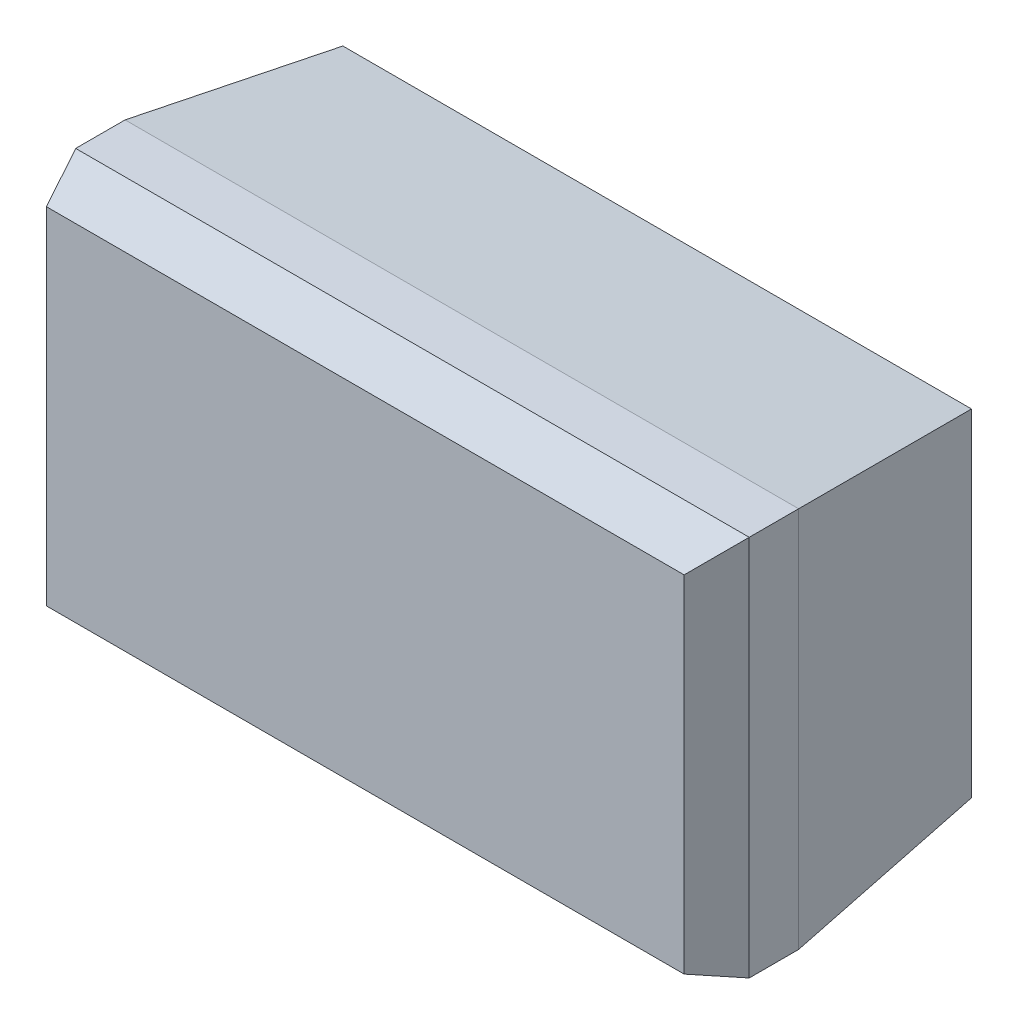
ISO-10303-21;
HEADER;
FILE_DESCRIPTION(('STEP AP214'),'2;1');
FILE_NAME('part.step','',(''),(''),'','','');
FILE_SCHEMA(('AUTOMOTIVE_DESIGN { 1 0 10303 214 1 1 1 1 }'));
ENDSEC;
DATA;
#1=APPLICATION_CONTEXT('core data for automotive mechanical design processes');
#2=APPLICATION_PROTOCOL_DEFINITION('international standard','automotive_design',2000,#1);
#3=PRODUCT_CONTEXT('',#1,'mechanical');
#4=PRODUCT('Part','Part','',(#3));
#5=PRODUCT_RELATED_PRODUCT_CATEGORY('part','',(#4));
#6=PRODUCT_DEFINITION_FORMATION('','',#4);
#7=PRODUCT_DEFINITION_CONTEXT('part definition',#1,'design');
#8=PRODUCT_DEFINITION('design','',#6,#7);
#9=PRODUCT_DEFINITION_SHAPE('','',#8);
#10=(LENGTH_UNIT() NAMED_UNIT(*) SI_UNIT(.MILLI.,.METRE.));
#11=(NAMED_UNIT(*) PLANE_ANGLE_UNIT() SI_UNIT($,.RADIAN.));
#12=(NAMED_UNIT(*) SI_UNIT($,.STERADIAN.) SOLID_ANGLE_UNIT());
#13=UNCERTAINTY_MEASURE_WITH_UNIT(LENGTH_MEASURE(1.E-05),#10,'distance_accuracy_value','');
#14=(GEOMETRIC_REPRESENTATION_CONTEXT(3) GLOBAL_UNCERTAINTY_ASSIGNED_CONTEXT((#13)) GLOBAL_UNIT_ASSIGNED_CONTEXT((#10,
#11,#12)) REPRESENTATION_CONTEXT('',''));
#15=CARTESIAN_POINT('',(0.,0.,0.));
#16=DIRECTION('',(0.,0.,1.));
#17=DIRECTION('',(1.,0.,0.));
#18=AXIS2_PLACEMENT_3D('',#15,#16,#17);
#19=CARTESIAN_POINT('',(0.,0.,0.));
#20=DIRECTION('',(0.,0.,1.));
#21=DIRECTION('',(1.,0.,0.));
#22=AXIS2_PLACEMENT_3D('',#19,#20,#21);
#23=PLANE('',#22);
#24=DIRECTION('',(1.,0.,0.));
#25=VECTOR('',#24,1.);
#26=CARTESIAN_POINT('',(1.5,0.750000000000417,0.));
#27=LINE('',#26,#25);
#28=CARTESIAN_POINT('',(-1.40000000000021,0.750000000000104,0.));
#29=VERTEX_POINT('',#28);
#30=CARTESIAN_POINT('',(1.40000000000021,0.750000000000104,0.));
#31=VERTEX_POINT('',#30);
#32=EDGE_CURVE('E108',#29,#31,#27,.T.);
#33=ORIENTED_EDGE('',*,*,#32,.T.);
#34=DIRECTION('',(0.,1.,0.));
#35=VECTOR('',#34,1.);
#36=CARTESIAN_POINT('',(1.40000000000042,-0.85,0.));
#37=LINE('',#36,#35);
#38=CARTESIAN_POINT('',(1.4000000000001,-0.750000000000209,0.));
#39=VERTEX_POINT('',#38);
#40=EDGE_CURVE('E86',#31,#39,#37,.F.);
#41=ORIENTED_EDGE('',*,*,#40,.T.);
#42=DIRECTION('',(1.,0.,0.));
#43=VECTOR('',#42,1.);
#44=CARTESIAN_POINT('',(-1.5,-0.750000000000417,0.));
#45=LINE('',#44,#43);
#46=CARTESIAN_POINT('',(-1.4000000000001,-0.750000000000104,0.));
#47=VERTEX_POINT('',#46);
#48=EDGE_CURVE('E80',#39,#47,#45,.F.);
#49=ORIENTED_EDGE('',*,*,#48,.T.);
#50=DIRECTION('',(0.,1.,0.));
#51=VECTOR('',#50,1.);
#52=CARTESIAN_POINT('',(-1.40000000000042,0.85,0.));
#53=LINE('',#52,#51);
#54=EDGE_CURVE('E20',#47,#29,#53,.T.);
#55=ORIENTED_EDGE('',*,*,#54,.T.);
#56=EDGE_LOOP('',(#33,#41,#49,#55));
#57=FACE_BOUND('',#56,.T.);
#58=ADVANCED_FACE('F17',(#57),#23,.F.);
#59=CARTESIAN_POINT('',(-1.5,0.85,0.87));
#60=DIRECTION('',(0.993458851833167,0.,0.114190672624019));
#61=DIRECTION('',(0.114190672624019,0.,-0.993458851833167));
#62=AXIS2_PLACEMENT_3D('',#59,#60,#61);
#63=PLANE('',#62);
#64=DIRECTION('',(-0.113453380097414,-0.113453380096941,0.98704440684756));
#65=VECTOR('',#64,1.);
#66=CARTESIAN_POINT('',(-1.4,-0.750000000000417,0.));
#67=LINE('',#66,#65);
#68=CARTESIAN_POINT('',(-1.5,-0.85,0.87));
#69=VERTEX_POINT('',#68);
#70=EDGE_CURVE('E88',#47,#69,#67,.T.);
#71=ORIENTED_EDGE('',*,*,#70,.T.);
#72=DIRECTION('',(0.,1.,0.));
#73=VECTOR('',#72,1.);
#74=CARTESIAN_POINT('',(-1.5,0.85,0.87));
#75=LINE('',#74,#73);
#76=CARTESIAN_POINT('',(-1.5,0.85,0.87));
#77=VERTEX_POINT('',#76);
#78=EDGE_CURVE('E110',#69,#77,#75,.T.);
#79=ORIENTED_EDGE('',*,*,#78,.T.);
#80=DIRECTION('',(0.113453380097415,-0.113453380096941,-0.98704440684756));
#81=VECTOR('',#80,1.);
#82=CARTESIAN_POINT('',(-1.5,0.85,0.87));
#83=LINE('',#82,#81);
#84=EDGE_CURVE('E93',#77,#29,#83,.T.);
#85=ORIENTED_EDGE('',*,*,#84,.T.);
#86=ORIENTED_EDGE('',*,*,#54,.F.);
#87=EDGE_LOOP('',(#71,#79,#85,#86));
#88=FACE_BOUND('',#87,.T.);
#89=ADVANCED_FACE('F90',(#88),#63,.F.);
#90=CARTESIAN_POINT('',(-1.5,-0.85,0.87));
#91=DIRECTION('',(0.,0.993458851833167,0.114190672624019));
#92=DIRECTION('',(0.,-0.114190672624019,0.993458851833167));
#93=AXIS2_PLACEMENT_3D('',#90,#91,#92);
#94=PLANE('',#93);
#95=ORIENTED_EDGE('',*,*,#70,.F.);
#96=ORIENTED_EDGE('',*,*,#48,.F.);
#97=DIRECTION('',(0.113453380096941,-0.113453380097414,0.98704440684756));
#98=VECTOR('',#97,1.);
#99=CARTESIAN_POINT('',(1.40000000000042,-0.75,0.));
#100=LINE('',#99,#98);
#101=CARTESIAN_POINT('',(1.5,-0.85,0.87));
#102=VERTEX_POINT('',#101);
#103=EDGE_CURVE('E100',#39,#102,#100,.T.);
#104=ORIENTED_EDGE('',*,*,#103,.T.);
#105=DIRECTION('',(1.,0.,0.));
#106=VECTOR('',#105,1.);
#107=CARTESIAN_POINT('',(-1.5,-0.85,0.87));
#108=LINE('',#107,#106);
#109=EDGE_CURVE('E98',#102,#69,#108,.F.);
#110=ORIENTED_EDGE('',*,*,#109,.T.);
#111=EDGE_LOOP('',(#95,#96,#104,#110));
#112=FACE_BOUND('',#111,.T.);
#113=ADVANCED_FACE('F96',(#112),#94,.F.);
#114=CARTESIAN_POINT('',(1.5,-0.85,0.87));
#115=DIRECTION('',(-0.993458851833167,0.,0.114190672624019));
#116=DIRECTION('',(0.114190672624019,0.,0.993458851833167));
#117=AXIS2_PLACEMENT_3D('',#114,#115,#116);
#118=PLANE('',#117);
#119=DIRECTION('',(0.113453380097414,0.113453380096941,0.98704440684756));
#120=VECTOR('',#119,1.);
#121=CARTESIAN_POINT('',(1.4,0.750000000000417,0.));
#122=LINE('',#121,#120);
#123=CARTESIAN_POINT('',(1.5,0.85,0.87));
#124=VERTEX_POINT('',#123);
#125=EDGE_CURVE('E105',#31,#124,#122,.T.);
#126=ORIENTED_EDGE('',*,*,#125,.T.);
#127=DIRECTION('',(0.,-1.,0.));
#128=VECTOR('',#127,1.);
#129=CARTESIAN_POINT('',(1.5,-0.85,0.87));
#130=LINE('',#129,#128);
#131=EDGE_CURVE('E117',#124,#102,#130,.T.);
#132=ORIENTED_EDGE('',*,*,#131,.T.);
#133=ORIENTED_EDGE('',*,*,#103,.F.);
#134=ORIENTED_EDGE('',*,*,#40,.F.);
#135=EDGE_LOOP('',(#126,#132,#133,#134));
#136=FACE_BOUND('',#135,.T.);
#137=ADVANCED_FACE('F184',(#136),#118,.F.);
#138=CARTESIAN_POINT('',(1.5,0.85,0.87));
#139=DIRECTION('',(0.,-0.993458851833167,0.114190672624019));
#140=DIRECTION('',(0.,-0.114190672624019,-0.993458851833167));
#141=AXIS2_PLACEMENT_3D('',#138,#139,#140);
#142=PLANE('',#141);
#143=ORIENTED_EDGE('',*,*,#84,.F.);
#144=DIRECTION('',(1.,0.,0.));
#145=VECTOR('',#144,1.);
#146=CARTESIAN_POINT('',(1.5,0.85,0.87));
#147=LINE('',#146,#145);
#148=EDGE_CURVE('E125',#77,#124,#147,.T.);
#149=ORIENTED_EDGE('',*,*,#148,.T.);
#150=ORIENTED_EDGE('',*,*,#125,.F.);
#151=ORIENTED_EDGE('',*,*,#32,.F.);
#152=EDGE_LOOP('',(#143,#149,#150,#151));
#153=FACE_BOUND('',#152,.T.);
#154=ADVANCED_FACE('F187',(#153),#142,.F.);
#155=CARTESIAN_POINT('',(-1.5,0.85,1.3));
#156=DIRECTION('',(1.,0.,0.));
#157=DIRECTION('',(0.,1.,0.));
#158=AXIS2_PLACEMENT_3D('',#155,#156,#157);
#159=PLANE('',#158);
#160=DIRECTION('',(0.,0.,1.));
#161=VECTOR('',#160,1.);
#162=CARTESIAN_POINT('',(-1.5,-0.85,1.3));
#163=LINE('',#162,#161);
#164=CARTESIAN_POINT('',(-1.5,-0.85,1.09));
#165=VERTEX_POINT('',#164);
#166=EDGE_CURVE('E112',#69,#165,#163,.T.);
#167=ORIENTED_EDGE('',*,*,#166,.T.);
#168=DIRECTION('',(0.,1.,0.));
#169=VECTOR('',#168,1.);
#170=CARTESIAN_POINT('',(-1.5,0.,1.09));
#171=LINE('',#170,#169);
#172=CARTESIAN_POINT('',(-1.5,0.85,1.09));
#173=VERTEX_POINT('',#172);
#174=EDGE_CURVE('E128',#173,#165,#171,.F.);
#175=ORIENTED_EDGE('',*,*,#174,.F.);
#176=DIRECTION('',(0.,0.,-1.));
#177=VECTOR('',#176,1.);
#178=CARTESIAN_POINT('',(-1.5,0.85,1.3));
#179=LINE('',#178,#177);
#180=EDGE_CURVE('E122',#173,#77,#179,.T.);
#181=ORIENTED_EDGE('',*,*,#180,.T.);
#182=ORIENTED_EDGE('',*,*,#78,.F.);
#183=EDGE_LOOP('',(#167,#175,#181,#182));
#184=FACE_BOUND('',#183,.T.);
#185=ADVANCED_FACE('F181',(#184),#159,.F.);
#186=CARTESIAN_POINT('',(-1.5,-0.85,1.3));
#187=DIRECTION('',(0.,1.,0.));
#188=DIRECTION('',(0.,0.,1.));
#189=AXIS2_PLACEMENT_3D('',#186,#187,#188);
#190=PLANE('',#189);
#191=DIRECTION('',(0.,0.,1.));
#192=VECTOR('',#191,1.);
#193=CARTESIAN_POINT('',(1.5,-0.85,1.3));
#194=LINE('',#193,#192);
#195=CARTESIAN_POINT('',(1.5,-0.85,1.09));
#196=VERTEX_POINT('',#195);
#197=EDGE_CURVE('E115',#102,#196,#194,.T.);
#198=ORIENTED_EDGE('',*,*,#197,.T.);
#199=DIRECTION('',(1.,0.,0.));
#200=VECTOR('',#199,1.);
#201=CARTESIAN_POINT('',(0.,-0.85,1.09));
#202=LINE('',#201,#200);
#203=EDGE_CURVE('E134',#165,#196,#202,.T.);
#204=ORIENTED_EDGE('',*,*,#203,.F.);
#205=ORIENTED_EDGE('',*,*,#166,.F.);
#206=ORIENTED_EDGE('',*,*,#109,.F.);
#207=EDGE_LOOP('',(#198,#204,#205,#206));
#208=FACE_BOUND('',#207,.T.);
#209=ADVANCED_FACE('F182',(#208),#190,.F.);
#210=CARTESIAN_POINT('',(1.5,-0.85,1.3));
#211=DIRECTION('',(-1.,0.,0.));
#212=DIRECTION('',(0.,-1.,0.));
#213=AXIS2_PLACEMENT_3D('',#210,#211,#212);
#214=PLANE('',#213);
#215=DIRECTION('',(0.,0.,-1.));
#216=VECTOR('',#215,1.);
#217=CARTESIAN_POINT('',(1.5,0.85,1.3));
#218=LINE('',#217,#216);
#219=CARTESIAN_POINT('',(1.5,0.85,1.09));
#220=VERTEX_POINT('',#219);
#221=EDGE_CURVE('E120',#124,#220,#218,.F.);
#222=ORIENTED_EDGE('',*,*,#221,.T.);
#223=DIRECTION('',(0.,1.,0.));
#224=VECTOR('',#223,1.);
#225=CARTESIAN_POINT('',(1.5,0.,1.09));
#226=LINE('',#225,#224);
#227=EDGE_CURVE('E140',#196,#220,#226,.T.);
#228=ORIENTED_EDGE('',*,*,#227,.F.);
#229=ORIENTED_EDGE('',*,*,#197,.F.);
#230=ORIENTED_EDGE('',*,*,#131,.F.);
#231=EDGE_LOOP('',(#222,#228,#229,#230));
#232=FACE_BOUND('',#231,.T.);
#233=ADVANCED_FACE('F168',(#232),#214,.F.);
#234=CARTESIAN_POINT('',(1.5,0.85,1.3));
#235=DIRECTION('',(0.,-1.,0.));
#236=DIRECTION('',(0.,0.,-1.));
#237=AXIS2_PLACEMENT_3D('',#234,#235,#236);
#238=PLANE('',#237);
#239=ORIENTED_EDGE('',*,*,#180,.F.);
#240=DIRECTION('',(1.,0.,0.));
#241=VECTOR('',#240,1.);
#242=CARTESIAN_POINT('',(0.,0.85,1.09));
#243=LINE('',#242,#241);
#244=EDGE_CURVE('E146',#220,#173,#243,.F.);
#245=ORIENTED_EDGE('',*,*,#244,.F.);
#246=ORIENTED_EDGE('',*,*,#221,.F.);
#247=ORIENTED_EDGE('',*,*,#148,.F.);
#248=EDGE_LOOP('',(#239,#245,#246,#247));
#249=FACE_BOUND('',#248,.T.);
#250=ADVANCED_FACE('F174',(#249),#238,.F.);
#251=CARTESIAN_POINT('',(-1.42,0.,1.3));
#252=DIRECTION('',(-0.934487734928968,0.,0.355995327591988));
#253=DIRECTION('',(0.355995327591988,0.,0.934487734928968));
#254=AXIS2_PLACEMENT_3D('',#251,#252,#253);
#255=PLANE('',#254);
#256=DIRECTION('',(-0.335377446520255,-0.335377446520255,-0.880365797115669));
#257=VECTOR('',#256,1.);
#258=CARTESIAN_POINT('',(-1.42,-0.77,1.3));
#259=LINE('',#258,#257);
#260=CARTESIAN_POINT('',(-1.42,-0.77,1.3));
#261=VERTEX_POINT('',#260);
#262=EDGE_CURVE('E131',#261,#165,#259,.T.);
#263=ORIENTED_EDGE('',*,*,#262,.F.);
#264=DIRECTION('',(0.,1.,0.));
#265=VECTOR('',#264,1.);
#266=CARTESIAN_POINT('',(-1.42,0.,1.3));
#267=LINE('',#266,#265);
#268=CARTESIAN_POINT('',(-1.42,0.77,1.3));
#269=VERTEX_POINT('',#268);
#270=EDGE_CURVE('E149',#269,#261,#267,.F.);
#271=ORIENTED_EDGE('',*,*,#270,.F.);
#272=DIRECTION('',(0.335377446520255,-0.335377446520255,0.880365797115669));
#273=VECTOR('',#272,1.);
#274=CARTESIAN_POINT('',(-1.5,0.85,1.09));
#275=LINE('',#274,#273);
#276=EDGE_CURVE('E142',#173,#269,#275,.T.);
#277=ORIENTED_EDGE('',*,*,#276,.F.);
#278=ORIENTED_EDGE('',*,*,#174,.T.);
#279=EDGE_LOOP('',(#263,#271,#277,#278));
#280=FACE_BOUND('',#279,.T.);
#281=ADVANCED_FACE('F179',(#280),#255,.T.);
#282=CARTESIAN_POINT('',(0.,-0.77,1.3));
#283=DIRECTION('',(0.,-0.934487734928968,0.355995327591988));
#284=DIRECTION('',(0.,-0.355995327591988,-0.934487734928968));
#285=AXIS2_PLACEMENT_3D('',#282,#283,#284);
#286=PLANE('',#285);
#287=ORIENTED_EDGE('',*,*,#262,.T.);
#288=ORIENTED_EDGE('',*,*,#203,.T.);
#289=DIRECTION('',(0.335377446520255,-0.335377446520255,-0.880365797115669));
#290=VECTOR('',#289,1.);
#291=CARTESIAN_POINT('',(1.42,-0.77,1.3));
#292=LINE('',#291,#290);
#293=CARTESIAN_POINT('',(1.42,-0.77,1.3));
#294=VERTEX_POINT('',#293);
#295=EDGE_CURVE('E137',#294,#196,#292,.T.);
#296=ORIENTED_EDGE('',*,*,#295,.F.);
#297=DIRECTION('',(1.,0.,0.));
#298=VECTOR('',#297,1.);
#299=CARTESIAN_POINT('',(0.,-0.77,1.3));
#300=LINE('',#299,#298);
#301=EDGE_CURVE('E152',#261,#294,#300,.T.);
#302=ORIENTED_EDGE('',*,*,#301,.F.);
#303=EDGE_LOOP('',(#287,#288,#296,#302));
#304=FACE_BOUND('',#303,.T.);
#305=ADVANCED_FACE('F163',(#304),#286,.T.);
#306=CARTESIAN_POINT('',(1.42,0.,1.3));
#307=DIRECTION('',(0.934487734928968,0.,0.355995327591988));
#308=DIRECTION('',(0.355995327591988,0.,-0.934487734928968));
#309=AXIS2_PLACEMENT_3D('',#306,#307,#308);
#310=PLANE('',#309);
#311=ORIENTED_EDGE('',*,*,#295,.T.);
#312=ORIENTED_EDGE('',*,*,#227,.T.);
#313=DIRECTION('',(0.335377446520255,0.335377446520255,-0.880365797115669));
#314=VECTOR('',#313,1.);
#315=CARTESIAN_POINT('',(1.42,0.77,1.3));
#316=LINE('',#315,#314);
#317=CARTESIAN_POINT('',(1.42,0.77,1.3));
#318=VERTEX_POINT('',#317);
#319=EDGE_CURVE('E35',#318,#220,#316,.T.);
#320=ORIENTED_EDGE('',*,*,#319,.F.);
#321=DIRECTION('',(0.,1.,0.));
#322=VECTOR('',#321,1.);
#323=CARTESIAN_POINT('',(1.42,0.,1.3));
#324=LINE('',#323,#322);
#325=EDGE_CURVE('E26',#294,#318,#324,.T.);
#326=ORIENTED_EDGE('',*,*,#325,.F.);
#327=EDGE_LOOP('',(#311,#312,#320,#326));
#328=FACE_BOUND('',#327,.T.);
#329=ADVANCED_FACE('F159',(#328),#310,.T.);
#330=CARTESIAN_POINT('',(0.,0.77,1.3));
#331=DIRECTION('',(0.,0.934487734928968,0.355995327591988));
#332=DIRECTION('',(0.,-0.355995327591988,0.934487734928968));
#333=AXIS2_PLACEMENT_3D('',#330,#331,#332);
#334=PLANE('',#333);
#335=ORIENTED_EDGE('',*,*,#319,.T.);
#336=ORIENTED_EDGE('',*,*,#244,.T.);
#337=ORIENTED_EDGE('',*,*,#276,.T.);
#338=DIRECTION('',(1.,0.,0.));
#339=VECTOR('',#338,1.);
#340=CARTESIAN_POINT('',(0.,0.77,1.3));
#341=LINE('',#340,#339);
#342=EDGE_CURVE('E11',#318,#269,#341,.F.);
#343=ORIENTED_EDGE('',*,*,#342,.F.);
#344=EDGE_LOOP('',(#335,#336,#337,#343));
#345=FACE_BOUND('',#344,.T.);
#346=ADVANCED_FACE('F176',(#345),#334,.T.);
#347=CARTESIAN_POINT('',(0.,0.,1.3));
#348=DIRECTION('',(0.,0.,1.));
#349=DIRECTION('',(1.,0.,0.));
#350=AXIS2_PLACEMENT_3D('',#347,#348,#349);
#351=PLANE('',#350);
#352=ORIENTED_EDGE('',*,*,#325,.T.);
#353=ORIENTED_EDGE('',*,*,#342,.T.);
#354=ORIENTED_EDGE('',*,*,#270,.T.);
#355=ORIENTED_EDGE('',*,*,#301,.T.);
#356=EDGE_LOOP('',(#352,#353,#354,#355));
#357=FACE_BOUND('',#356,.T.);
#358=ADVANCED_FACE('F157',(#357),#351,.T.);
#359=CLOSED_SHELL('',(#58,#89,#113,#137,#154,#185,#209,#233,#250,#281,#305,#329,#346,#358));
#360=MANIFOLD_SOLID_BREP('B1',#359);
#361=ADVANCED_BREP_SHAPE_REPRESENTATION('',(#18,#360),#14);
#362=SHAPE_DEFINITION_REPRESENTATION(#9,#361);
ENDSEC;
END-ISO-10303-21;
